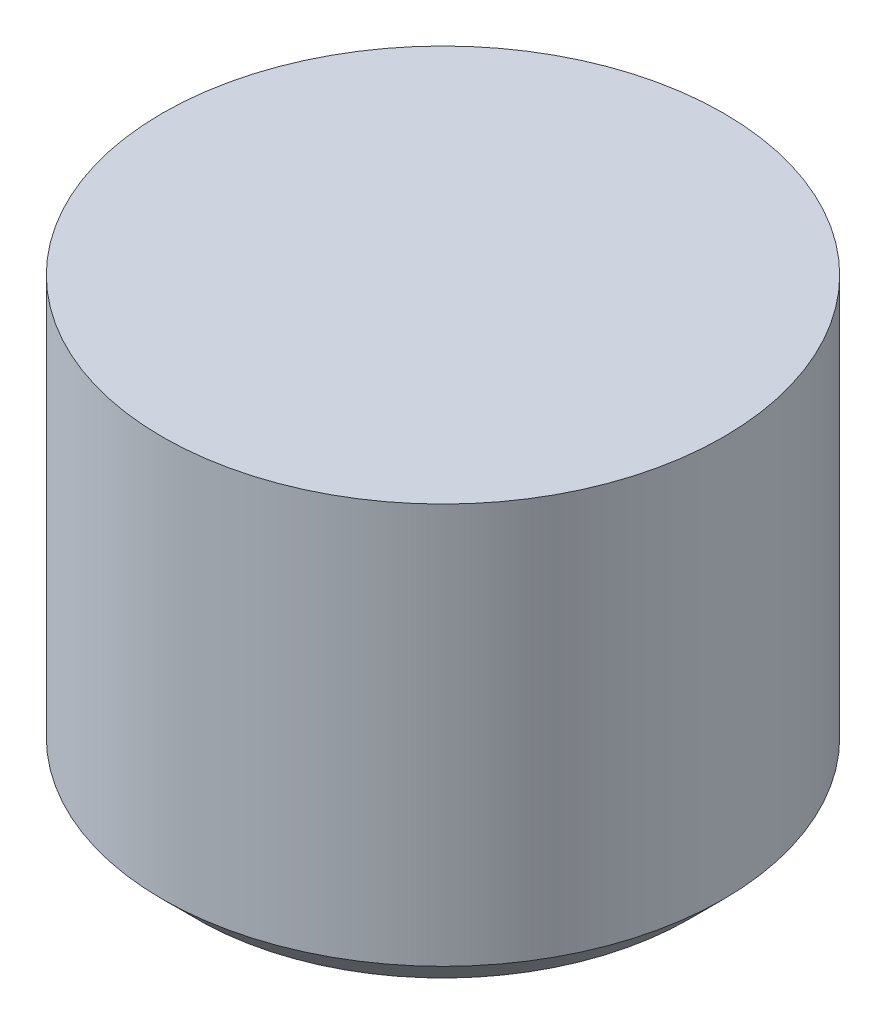
ISO-10303-21;
HEADER;
FILE_DESCRIPTION(('STEP AP214'),'2;1');
FILE_NAME('part.step','',(''),(''),'','','');
FILE_SCHEMA(('AUTOMOTIVE_DESIGN { 1 0 10303 214 1 1 1 1 }'));
ENDSEC;
DATA;
#1=APPLICATION_CONTEXT('core data for automotive mechanical design processes');
#2=APPLICATION_PROTOCOL_DEFINITION('international standard','automotive_design',2000,#1);
#3=PRODUCT_CONTEXT('',#1,'mechanical');
#4=PRODUCT('Part','Part','',(#3));
#5=PRODUCT_RELATED_PRODUCT_CATEGORY('part','',(#4));
#6=PRODUCT_DEFINITION_FORMATION('','',#4);
#7=PRODUCT_DEFINITION_CONTEXT('part definition',#1,'design');
#8=PRODUCT_DEFINITION('design','',#6,#7);
#9=PRODUCT_DEFINITION_SHAPE('','',#8);
#10=(LENGTH_UNIT() NAMED_UNIT(*) SI_UNIT(.MILLI.,.METRE.));
#11=(NAMED_UNIT(*) PLANE_ANGLE_UNIT() SI_UNIT($,.RADIAN.));
#12=(NAMED_UNIT(*) SI_UNIT($,.STERADIAN.) SOLID_ANGLE_UNIT());
#13=UNCERTAINTY_MEASURE_WITH_UNIT(LENGTH_MEASURE(1.E-05),#10,'distance_accuracy_value','');
#14=(GEOMETRIC_REPRESENTATION_CONTEXT(3) GLOBAL_UNCERTAINTY_ASSIGNED_CONTEXT((#13)) GLOBAL_UNIT_ASSIGNED_CONTEXT((#10,
#11,#12)) REPRESENTATION_CONTEXT('',''));
#15=CARTESIAN_POINT('',(0.,0.,0.));
#16=DIRECTION('',(0.,0.,1.));
#17=DIRECTION('',(1.,0.,0.));
#18=AXIS2_PLACEMENT_3D('',#15,#16,#17);
#19=CARTESIAN_POINT('',(0.,17.4168127053669,0.));
#20=DIRECTION('',(0.,1.,0.));
#21=DIRECTION('',(-1.,0.,0.));
#22=AXIS2_PLACEMENT_3D('',#19,#20,#21);
#23=PLANE('',#22);
#24=CARTESIAN_POINT('',(0.,17.4168127053669,0.));
#25=DIRECTION('',(0.,1.,0.));
#26=DIRECTION('',(-1.,0.,0.));
#27=AXIS2_PLACEMENT_3D('',#24,#25,#26);
#28=CIRCLE('',#27,24.425);
#29=CARTESIAN_POINT('',(-24.425,17.4168127053669,0.));
#30=VERTEX_POINT('',#29);
#31=EDGE_CURVE('E10',#30,#30,#28,.T.);
#32=ORIENTED_EDGE('',*,*,#31,.T.);
#33=EDGE_LOOP('',(#32));
#34=FACE_BOUND('',#33,.T.);
#35=ADVANCED_FACE('F28',(#34),#23,.T.);
#36=CARTESIAN_POINT('',(0.,17.4168127053669,0.));
#37=DIRECTION('',(0.,1.,0.));
#38=DIRECTION('',(-1.,0.,0.));
#39=AXIS2_PLACEMENT_3D('',#36,#37,#38);
#40=CYLINDRICAL_SURFACE('',#39,24.425);
#41=CARTESIAN_POINT('',(0.,-17.4431872946331,0.));
#42=DIRECTION('',(0.,1.,0.));
#43=DIRECTION('',(-1.,0.,0.));
#44=AXIS2_PLACEMENT_3D('',#41,#42,#43);
#45=CIRCLE('',#44,24.425);
#46=CARTESIAN_POINT('',(-24.425,-17.4431872946331,0.));
#47=VERTEX_POINT('',#46);
#48=EDGE_CURVE('E34',#47,#47,#45,.T.);
#49=ORIENTED_EDGE('',*,*,#48,.T.);
#50=EDGE_LOOP('',(#49));
#51=FACE_BOUND('',#50,.T.);
#52=ORIENTED_EDGE('',*,*,#31,.F.);
#53=EDGE_LOOP('',(#52));
#54=FACE_BOUND('',#53,.T.);
#55=ADVANCED_FACE('F54',(#51,#54),#40,.T.);
#56=CARTESIAN_POINT('',(0.,-17.4431872946331,0.));
#57=DIRECTION('',(0.,1.,0.));
#58=DIRECTION('',(-1.,0.,0.));
#59=AXIS2_PLACEMENT_3D('',#56,#57,#58);
#60=CONICAL_SURFACE('',#59,24.425,0.785398163397447);
#61=CARTESIAN_POINT('',(0.,-20.4431872946331,0.));
#62=DIRECTION('',(0.,1.,0.));
#63=DIRECTION('',(-1.,0.,0.));
#64=AXIS2_PLACEMENT_3D('',#61,#62,#63);
#65=CIRCLE('',#64,21.425);
#66=CARTESIAN_POINT('',(-21.425,-20.4431872946331,0.));
#67=VERTEX_POINT('',#66);
#68=EDGE_CURVE('E38',#67,#67,#65,.T.);
#69=ORIENTED_EDGE('',*,*,#68,.T.);
#70=EDGE_LOOP('',(#69));
#71=FACE_BOUND('',#70,.T.);
#72=ORIENTED_EDGE('',*,*,#48,.F.);
#73=EDGE_LOOP('',(#72));
#74=FACE_BOUND('',#73,.T.);
#75=ADVANCED_FACE('F45',(#71,#74),#60,.T.);
#76=CARTESIAN_POINT('',(-21.425,-20.4431872946331,0.));
#77=DIRECTION('',(0.,-1.,0.));
#78=DIRECTION('',(1.,0.,0.));
#79=AXIS2_PLACEMENT_3D('',#76,#77,#78);
#80=PLANE('',#79);
#81=ORIENTED_EDGE('',*,*,#68,.F.);
#82=EDGE_LOOP('',(#81));
#83=FACE_BOUND('',#82,.T.);
#84=ADVANCED_FACE('F48',(#83),#80,.T.);
#85=CLOSED_SHELL('',(#35,#55,#75,#84));
#86=MANIFOLD_SOLID_BREP('B2',#85);
#87=ADVANCED_BREP_SHAPE_REPRESENTATION('',(#18,#86),#14);
#88=SHAPE_DEFINITION_REPRESENTATION(#9,#87);
ENDSEC;
END-ISO-10303-21;
